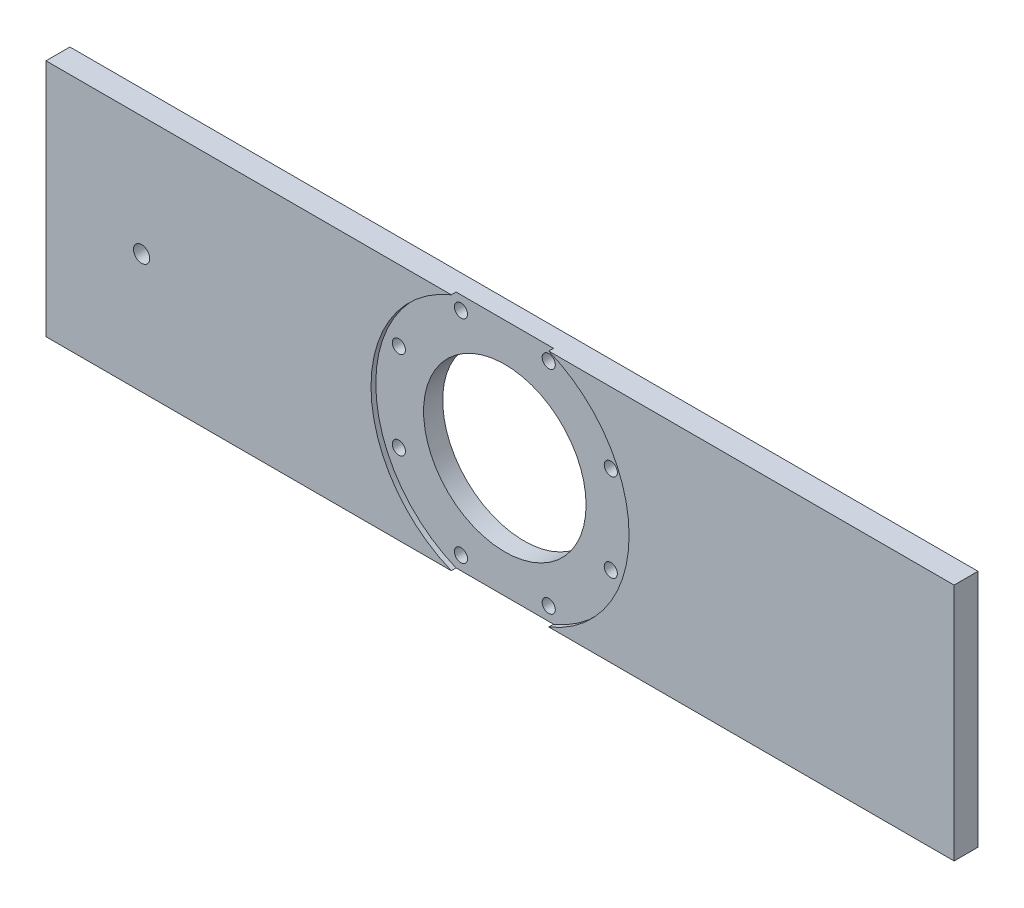
ISO-10303-21;
HEADER;
FILE_DESCRIPTION(('STEP AP214'),'2;1');
FILE_NAME('part.step','',(''),(''),'','','');
FILE_SCHEMA(('AUTOMOTIVE_DESIGN { 1 0 10303 214 1 1 1 1 }'));
ENDSEC;
DATA;
#1=APPLICATION_CONTEXT('core data for automotive mechanical design processes');
#2=APPLICATION_PROTOCOL_DEFINITION('international standard','automotive_design',2000,#1);
#3=PRODUCT_CONTEXT('',#1,'mechanical');
#4=PRODUCT('Part','Part','',(#3));
#5=PRODUCT_RELATED_PRODUCT_CATEGORY('part','',(#4));
#6=PRODUCT_DEFINITION_FORMATION('','',#4);
#7=PRODUCT_DEFINITION_CONTEXT('part definition',#1,'design');
#8=PRODUCT_DEFINITION('design','',#6,#7);
#9=PRODUCT_DEFINITION_SHAPE('','',#8);
#10=(LENGTH_UNIT() NAMED_UNIT(*) SI_UNIT(.MILLI.,.METRE.));
#11=(NAMED_UNIT(*) PLANE_ANGLE_UNIT() SI_UNIT($,.RADIAN.));
#12=(NAMED_UNIT(*) SI_UNIT($,.STERADIAN.) SOLID_ANGLE_UNIT());
#13=UNCERTAINTY_MEASURE_WITH_UNIT(LENGTH_MEASURE(1.E-05),#10,'distance_accuracy_value','');
#14=(GEOMETRIC_REPRESENTATION_CONTEXT(3) GLOBAL_UNCERTAINTY_ASSIGNED_CONTEXT((#13)) GLOBAL_UNIT_ASSIGNED_CONTEXT((#10,
#11,#12)) REPRESENTATION_CONTEXT('',''));
#15=CARTESIAN_POINT('',(0.,0.,0.));
#16=DIRECTION('',(0.,0.,1.));
#17=DIRECTION('',(1.,0.,0.));
#18=AXIS2_PLACEMENT_3D('',#15,#16,#17);
#19=CARTESIAN_POINT('',(0.,0.,10.));
#20=DIRECTION('',(0.,0.,1.));
#21=DIRECTION('',(1.,0.,0.));
#22=AXIS2_PLACEMENT_3D('',#19,#20,#21);
#23=PLANE('',#22);
#24=CARTESIAN_POINT('',(-150.,0.,10.));
#25=DIRECTION('',(0.,0.,1.));
#26=DIRECTION('',(1.,0.,0.));
#27=AXIS2_PLACEMENT_3D('',#24,#25,#26);
#28=CIRCLE('',#27,3.4);
#29=CARTESIAN_POINT('',(-146.6,0.,10.));
#30=VERTEX_POINT('',#29);
#31=EDGE_CURVE('E236',#30,#30,#28,.T.);
#32=ORIENTED_EDGE('',*,*,#31,.F.);
#33=EDGE_LOOP('',(#32));
#34=FACE_BOUND('',#33,.T.);
#35=CARTESIAN_POINT('',(0.,0.,10.));
#36=DIRECTION('',(0.,0.,1.));
#37=DIRECTION('',(1.,0.,0.));
#38=AXIS2_PLACEMENT_3D('',#35,#36,#37);
#39=CIRCLE('',#38,54.);
#40=CARTESIAN_POINT('',(-20.3960780543711,50.,10.));
#41=VERTEX_POINT('',#40);
#42=CARTESIAN_POINT('',(-20.3960780543711,-50.,10.));
#43=VERTEX_POINT('',#42);
#44=EDGE_CURVE('E45',#41,#43,#39,.T.);
#45=ORIENTED_EDGE('',*,*,#44,.F.);
#46=DIRECTION('',(-1.,0.,0.));
#47=VECTOR('',#46,1.);
#48=CARTESIAN_POINT('',(190.,50.,10.));
#49=LINE('',#48,#47);
#50=CARTESIAN_POINT('',(-190.,50.,10.));
#51=VERTEX_POINT('',#50);
#52=EDGE_CURVE('E137',#41,#51,#49,.T.);
#53=ORIENTED_EDGE('',*,*,#52,.T.);
#54=DIRECTION('',(0.,1.,0.));
#55=VECTOR('',#54,1.);
#56=CARTESIAN_POINT('',(-190.,-50.,10.));
#57=LINE('',#56,#55);
#58=CARTESIAN_POINT('',(-190.,-50.,10.));
#59=VERTEX_POINT('',#58);
#60=EDGE_CURVE('E140',#59,#51,#57,.T.);
#61=ORIENTED_EDGE('',*,*,#60,.F.);
#62=DIRECTION('',(-1.,0.,0.));
#63=VECTOR('',#62,1.);
#64=CARTESIAN_POINT('',(190.,-50.,10.));
#65=LINE('',#64,#63);
#66=EDGE_CURVE('E143',#43,#59,#65,.T.);
#67=ORIENTED_EDGE('',*,*,#66,.F.);
#68=EDGE_LOOP('',(#45,#53,#61,#67));
#69=FACE_BOUND('',#68,.T.);
#70=ADVANCED_FACE('F37',(#34,#69),#23,.T.);
#71=CARTESIAN_POINT('',(190.,-50.,10.));
#72=DIRECTION('',(-1.,0.,0.));
#73=DIRECTION('',(0.,0.,1.));
#74=AXIS2_PLACEMENT_3D('',#71,#72,#73);
#75=PLANE('',#74);
#76=DIRECTION('',(0.,1.,0.));
#77=VECTOR('',#76,1.);
#78=CARTESIAN_POINT('',(190.,-50.,0.));
#79=LINE('',#78,#77);
#80=CARTESIAN_POINT('',(190.,-50.,0.));
#81=VERTEX_POINT('',#80);
#82=CARTESIAN_POINT('',(190.,50.,0.));
#83=VERTEX_POINT('',#82);
#84=EDGE_CURVE('E129',#81,#83,#79,.T.);
#85=ORIENTED_EDGE('',*,*,#84,.T.);
#86=DIRECTION('',(0.,0.,-1.));
#87=VECTOR('',#86,1.);
#88=CARTESIAN_POINT('',(190.,50.,10.));
#89=LINE('',#88,#87);
#90=CARTESIAN_POINT('',(190.,50.,10.));
#91=VERTEX_POINT('',#90);
#92=EDGE_CURVE('E158',#91,#83,#89,.T.);
#93=ORIENTED_EDGE('',*,*,#92,.F.);
#94=DIRECTION('',(0.,1.,0.));
#95=VECTOR('',#94,1.);
#96=CARTESIAN_POINT('',(190.,-50.,10.));
#97=LINE('',#96,#95);
#98=CARTESIAN_POINT('',(190.,-50.,10.));
#99=VERTEX_POINT('',#98);
#100=EDGE_CURVE('E135',#99,#91,#97,.T.);
#101=ORIENTED_EDGE('',*,*,#100,.F.);
#102=DIRECTION('',(0.,0.,-1.));
#103=VECTOR('',#102,1.);
#104=CARTESIAN_POINT('',(190.,-50.,10.));
#105=LINE('',#104,#103);
#106=EDGE_CURVE('E61',#99,#81,#105,.T.);
#107=ORIENTED_EDGE('',*,*,#106,.T.);
#108=EDGE_LOOP('',(#85,#93,#101,#107));
#109=FACE_BOUND('',#108,.T.);
#110=ADVANCED_FACE('F39',(#109),#75,.F.);
#111=CARTESIAN_POINT('',(190.,50.,10.));
#112=DIRECTION('',(0.,-1.,0.));
#113=DIRECTION('',(1.,0.,0.));
#114=AXIS2_PLACEMENT_3D('',#111,#112,#113);
#115=PLANE('',#114);
#116=DIRECTION('',(-1.,0.,0.));
#117=VECTOR('',#116,1.);
#118=CARTESIAN_POINT('',(190.,50.,8.));
#119=LINE('',#118,#117);
#120=CARTESIAN_POINT('',(20.3960780543711,50.,8.));
#121=VERTEX_POINT('',#120);
#122=CARTESIAN_POINT('',(-20.3960780543711,50.,8.));
#123=VERTEX_POINT('',#122);
#124=EDGE_CURVE('E116',#121,#123,#119,.T.);
#125=ORIENTED_EDGE('',*,*,#124,.F.);
#126=DIRECTION('',(0.,0.,1.));
#127=VECTOR('',#126,1.);
#128=CARTESIAN_POINT('',(20.3960780543711,50.,8.));
#129=LINE('',#128,#127);
#130=CARTESIAN_POINT('',(20.3960780543711,50.,10.));
#131=VERTEX_POINT('',#130);
#132=EDGE_CURVE('E110',#121,#131,#129,.T.);
#133=ORIENTED_EDGE('',*,*,#132,.T.);
#134=EDGE_CURVE('E88',#91,#131,#49,.T.);
#135=ORIENTED_EDGE('',*,*,#134,.F.);
#136=ORIENTED_EDGE('',*,*,#92,.T.);
#137=DIRECTION('',(-1.,0.,0.));
#138=VECTOR('',#137,1.);
#139=CARTESIAN_POINT('',(190.,50.,0.));
#140=LINE('',#139,#138);
#141=CARTESIAN_POINT('',(-190.,50.,0.));
#142=VERTEX_POINT('',#141);
#143=EDGE_CURVE('E131',#83,#142,#140,.T.);
#144=ORIENTED_EDGE('',*,*,#143,.T.);
#145=DIRECTION('',(0.,0.,-1.));
#146=VECTOR('',#145,1.);
#147=CARTESIAN_POINT('',(-190.,50.,10.));
#148=LINE('',#147,#146);
#149=EDGE_CURVE('E156',#51,#142,#148,.T.);
#150=ORIENTED_EDGE('',*,*,#149,.F.);
#151=ORIENTED_EDGE('',*,*,#52,.F.);
#152=DIRECTION('',(0.,0.,1.));
#153=VECTOR('',#152,1.);
#154=CARTESIAN_POINT('',(-20.3960780543711,50.,8.));
#155=LINE('',#154,#153);
#156=EDGE_CURVE('E117',#41,#123,#155,.F.);
#157=ORIENTED_EDGE('',*,*,#156,.T.);
#158=EDGE_LOOP('',(#125,#133,#135,#136,#144,#150,#151,#157));
#159=FACE_BOUND('',#158,.T.);
#160=ADVANCED_FACE('F127',(#159),#115,.F.);
#161=CARTESIAN_POINT('',(-190.,-50.,10.));
#162=DIRECTION('',(-1.,0.,0.));
#163=DIRECTION('',(0.,0.,1.));
#164=AXIS2_PLACEMENT_3D('',#161,#162,#163);
#165=PLANE('',#164);
#166=DIRECTION('',(0.,1.,0.));
#167=VECTOR('',#166,1.);
#168=CARTESIAN_POINT('',(-190.,-50.,0.));
#169=LINE('',#168,#167);
#170=CARTESIAN_POINT('',(-190.,-50.,0.));
#171=VERTEX_POINT('',#170);
#172=EDGE_CURVE('E148',#171,#142,#169,.T.);
#173=ORIENTED_EDGE('',*,*,#172,.F.);
#174=DIRECTION('',(0.,0.,-1.));
#175=VECTOR('',#174,1.);
#176=CARTESIAN_POINT('',(-190.,-50.,10.));
#177=LINE('',#176,#175);
#178=EDGE_CURVE('E154',#59,#171,#177,.T.);
#179=ORIENTED_EDGE('',*,*,#178,.F.);
#180=ORIENTED_EDGE('',*,*,#60,.T.);
#181=ORIENTED_EDGE('',*,*,#149,.T.);
#182=EDGE_LOOP('',(#173,#179,#180,#181));
#183=FACE_BOUND('',#182,.T.);
#184=ADVANCED_FACE('F173',(#183),#165,.T.);
#185=CARTESIAN_POINT('',(190.,-50.,10.));
#186=DIRECTION('',(0.,-1.,0.));
#187=DIRECTION('',(1.,0.,0.));
#188=AXIS2_PLACEMENT_3D('',#185,#186,#187);
#189=PLANE('',#188);
#190=DIRECTION('',(0.,0.,1.));
#191=VECTOR('',#190,1.);
#192=CARTESIAN_POINT('',(20.3960780543711,-50.,8.));
#193=LINE('',#192,#191);
#194=CARTESIAN_POINT('',(20.3960780543711,-50.,8.));
#195=VERTEX_POINT('',#194);
#196=CARTESIAN_POINT('',(20.3960780543711,-50.,10.));
#197=VERTEX_POINT('',#196);
#198=EDGE_CURVE('E52',#195,#197,#193,.T.);
#199=ORIENTED_EDGE('',*,*,#198,.F.);
#200=DIRECTION('',(-1.,0.,0.));
#201=VECTOR('',#200,1.);
#202=CARTESIAN_POINT('',(190.,-50.,8.));
#203=LINE('',#202,#201);
#204=CARTESIAN_POINT('',(-20.3960780543711,-50.,8.));
#205=VERTEX_POINT('',#204);
#206=EDGE_CURVE('E11',#195,#205,#203,.T.);
#207=ORIENTED_EDGE('',*,*,#206,.T.);
#208=DIRECTION('',(0.,0.,1.));
#209=VECTOR('',#208,1.);
#210=CARTESIAN_POINT('',(-20.3960780543711,-50.,8.));
#211=LINE('',#210,#209);
#212=EDGE_CURVE('E163',#43,#205,#211,.F.);
#213=ORIENTED_EDGE('',*,*,#212,.F.);
#214=ORIENTED_EDGE('',*,*,#66,.T.);
#215=ORIENTED_EDGE('',*,*,#178,.T.);
#216=DIRECTION('',(-1.,0.,0.));
#217=VECTOR('',#216,1.);
#218=CARTESIAN_POINT('',(190.,-50.,0.));
#219=LINE('',#218,#217);
#220=EDGE_CURVE('E138',#81,#171,#219,.T.);
#221=ORIENTED_EDGE('',*,*,#220,.F.);
#222=ORIENTED_EDGE('',*,*,#106,.F.);
#223=EDGE_CURVE('E144',#99,#197,#65,.T.);
#224=ORIENTED_EDGE('',*,*,#223,.T.);
#225=EDGE_LOOP('',(#199,#207,#213,#214,#215,#221,#222,#224));
#226=FACE_BOUND('',#225,.T.);
#227=ADVANCED_FACE('F166',(#226),#189,.T.);
#228=EDGE_CURVE('E114',#197,#131,#39,.T.);
#229=ORIENTED_EDGE('',*,*,#228,.F.);
#230=ORIENTED_EDGE('',*,*,#223,.F.);
#231=ORIENTED_EDGE('',*,*,#100,.T.);
#232=ORIENTED_EDGE('',*,*,#134,.T.);
#233=EDGE_LOOP('',(#229,#230,#231,#232));
#234=FACE_BOUND('',#233,.T.);
#235=ADVANCED_FACE('F179',(#234),#23,.T.);
#236=CARTESIAN_POINT('',(0.,0.,0.));
#237=DIRECTION('',(0.,0.,1.));
#238=DIRECTION('',(1.,0.,0.));
#239=AXIS2_PLACEMENT_3D('',#236,#237,#238);
#240=PLANE('',#239);
#241=CARTESIAN_POINT('',(-150.,0.,0.));
#242=DIRECTION('',(0.,0.,1.));
#243=DIRECTION('',(1.,0.,0.));
#244=AXIS2_PLACEMENT_3D('',#241,#242,#243);
#245=CIRCLE('',#244,3.4);
#246=CARTESIAN_POINT('',(-146.6,0.,0.));
#247=VERTEX_POINT('',#246);
#248=EDGE_CURVE('E233',#247,#247,#245,.T.);
#249=ORIENTED_EDGE('',*,*,#248,.T.);
#250=EDGE_LOOP('',(#249));
#251=FACE_BOUND('',#250,.T.);
#252=CARTESIAN_POINT('',(0.,0.,0.));
#253=DIRECTION('',(0.,0.,1.));
#254=DIRECTION('',(1.,0.,0.));
#255=AXIS2_PLACEMENT_3D('',#252,#253,#254);
#256=CIRCLE('',#255,34.);
#257=CARTESIAN_POINT('',(34.,0.,0.));
#258=VERTEX_POINT('',#257);
#259=EDGE_CURVE('E198',#258,#258,#256,.T.);
#260=ORIENTED_EDGE('',*,*,#259,.T.);
#261=EDGE_LOOP('',(#260));
#262=FACE_BOUND('',#261,.T.);
#263=CARTESIAN_POINT('',(-44.346217560542,18.3688047535237,0.));
#264=DIRECTION('',(0.,0.,1.));
#265=DIRECTION('',(0.707106781186556,-0.707106781186539,0.));
#266=AXIS2_PLACEMENT_3D('',#263,#264,#265);
#267=CIRCLE('',#266,2.75);
#268=CARTESIAN_POINT('',(-42.401673912279,16.4242611052608,0.));
#269=VERTEX_POINT('',#268);
#270=EDGE_CURVE('E197',#269,#269,#267,.T.);
#271=ORIENTED_EDGE('',*,*,#270,.T.);
#272=EDGE_LOOP('',(#271));
#273=FACE_BOUND('',#272,.T.);
#274=CARTESIAN_POINT('',(-18.3688047535248,44.3462175605416,0.));
#275=DIRECTION('',(0.,0.,1.));
#276=DIRECTION('',(0.,-1.,0.));
#277=AXIS2_PLACEMENT_3D('',#274,#275,#276);
#278=CIRCLE('',#277,2.75);
#279=CARTESIAN_POINT('',(-18.3688047535248,41.5962175605416,0.));
#280=VERTEX_POINT('',#279);
#281=EDGE_CURVE('E204',#280,#280,#278,.T.);
#282=ORIENTED_EDGE('',*,*,#281,.T.);
#283=EDGE_LOOP('',(#282));
#284=FACE_BOUND('',#283,.T.);
#285=CARTESIAN_POINT('',(18.3688047535239,44.3462175605419,0.));
#286=DIRECTION('',(0.,0.,1.));
#287=DIRECTION('',(-0.707106781186541,-0.707106781186554,0.));
#288=AXIS2_PLACEMENT_3D('',#285,#286,#287);
#289=CIRCLE('',#288,2.75);
#290=CARTESIAN_POINT('',(16.4242611052609,42.4016739122789,0.));
#291=VERTEX_POINT('',#290);
#292=EDGE_CURVE('E210',#291,#291,#289,.T.);
#293=ORIENTED_EDGE('',*,*,#292,.T.);
#294=EDGE_LOOP('',(#293));
#295=FACE_BOUND('',#294,.T.);
#296=CARTESIAN_POINT('',(44.3462175605418,18.3688047535243,0.));
#297=DIRECTION('',(0.,0.,1.));
#298=DIRECTION('',(-1.,0.,0.));
#299=AXIS2_PLACEMENT_3D('',#296,#297,#298);
#300=CIRCLE('',#299,2.75);
#301=CARTESIAN_POINT('',(41.5962175605418,18.3688047535243,0.));
#302=VERTEX_POINT('',#301);
#303=EDGE_CURVE('E216',#302,#302,#300,.T.);
#304=ORIENTED_EDGE('',*,*,#303,.T.);
#305=EDGE_LOOP('',(#304));
#306=FACE_BOUND('',#305,.T.);
#307=CARTESIAN_POINT('',(44.3462175605419,-18.368804753524,0.));
#308=DIRECTION('',(0.,0.,1.));
#309=DIRECTION('',(-0.707106781186551,0.707106781186544,0.));
#310=AXIS2_PLACEMENT_3D('',#307,#308,#309);
#311=CIRCLE('',#310,2.75);
#312=CARTESIAN_POINT('',(42.4016739122789,-16.424261105261,0.));
#313=VERTEX_POINT('',#312);
#314=EDGE_CURVE('E222',#313,#313,#311,.T.);
#315=ORIENTED_EDGE('',*,*,#314,.T.);
#316=EDGE_LOOP('',(#315));
#317=FACE_BOUND('',#316,.T.);
#318=CARTESIAN_POINT('',(18.3688047535245,-44.3462175605417,0.));
#319=DIRECTION('',(0.,0.,1.));
#320=DIRECTION('',(0.,1.,0.));
#321=AXIS2_PLACEMENT_3D('',#318,#319,#320);
#322=CIRCLE('',#321,2.75);
#323=CARTESIAN_POINT('',(18.3688047535245,-41.5962175605417,0.));
#324=VERTEX_POINT('',#323);
#325=EDGE_CURVE('E191',#324,#324,#322,.T.);
#326=ORIENTED_EDGE('',*,*,#325,.T.);
#327=EDGE_LOOP('',(#326));
#328=FACE_BOUND('',#327,.T.);
#329=CARTESIAN_POINT('',(-18.3688047535242,-44.3462175605418,0.));
#330=DIRECTION('',(0.,0.,1.));
#331=DIRECTION('',(0.707106781186546,0.707106781186549,0.));
#332=AXIS2_PLACEMENT_3D('',#329,#330,#331);
#333=CIRCLE('',#332,2.75);
#334=CARTESIAN_POINT('',(-16.4242611052612,-42.4016739122788,0.));
#335=VERTEX_POINT('',#334);
#336=EDGE_CURVE('E185',#335,#335,#333,.T.);
#337=ORIENTED_EDGE('',*,*,#336,.T.);
#338=EDGE_LOOP('',(#337));
#339=FACE_BOUND('',#338,.T.);
#340=CARTESIAN_POINT('',(-44.3462175605418,-18.3688047535243,0.));
#341=DIRECTION('',(0.,0.,1.));
#342=DIRECTION('',(1.,0.,0.));
#343=AXIS2_PLACEMENT_3D('',#340,#341,#342);
#344=CIRCLE('',#343,2.75);
#345=CARTESIAN_POINT('',(-41.5962175605418,-18.3688047535243,0.));
#346=VERTEX_POINT('',#345);
#347=EDGE_CURVE('E124',#346,#346,#344,.T.);
#348=ORIENTED_EDGE('',*,*,#347,.T.);
#349=EDGE_LOOP('',(#348));
#350=FACE_BOUND('',#349,.T.);
#351=ORIENTED_EDGE('',*,*,#84,.F.);
#352=ORIENTED_EDGE('',*,*,#220,.T.);
#353=ORIENTED_EDGE('',*,*,#172,.T.);
#354=ORIENTED_EDGE('',*,*,#143,.F.);
#355=EDGE_LOOP('',(#351,#352,#353,#354));
#356=FACE_BOUND('',#355,.T.);
#357=ADVANCED_FACE('F175',(#251,#262,#273,#284,#295,#306,#317,#328,#339,#350,#356),#240,.F.);
#358=CARTESIAN_POINT('',(0.,0.,8.));
#359=DIRECTION('',(0.,0.,1.));
#360=DIRECTION('',(1.,0.,0.));
#361=AXIS2_PLACEMENT_3D('',#358,#359,#360);
#362=PLANE('',#361);
#363=CARTESIAN_POINT('',(0.,0.,8.));
#364=DIRECTION('',(0.,0.,1.));
#365=DIRECTION('',(1.,0.,0.));
#366=AXIS2_PLACEMENT_3D('',#363,#364,#365);
#367=CIRCLE('',#366,34.);
#368=CARTESIAN_POINT('',(34.,0.,8.));
#369=VERTEX_POINT('',#368);
#370=EDGE_CURVE('E230',#369,#369,#367,.T.);
#371=ORIENTED_EDGE('',*,*,#370,.F.);
#372=EDGE_LOOP('',(#371));
#373=FACE_BOUND('',#372,.T.);
#374=CARTESIAN_POINT('',(-44.346217560542,18.3688047535237,8.));
#375=DIRECTION('',(0.,0.,1.));
#376=DIRECTION('',(0.707106781186556,-0.707106781186539,0.));
#377=AXIS2_PLACEMENT_3D('',#374,#375,#376);
#378=CIRCLE('',#377,2.75);
#379=CARTESIAN_POINT('',(-42.401673912279,16.4242611052608,8.));
#380=VERTEX_POINT('',#379);
#381=EDGE_CURVE('E194',#380,#380,#378,.T.);
#382=ORIENTED_EDGE('',*,*,#381,.F.);
#383=EDGE_LOOP('',(#382));
#384=FACE_BOUND('',#383,.T.);
#385=CARTESIAN_POINT('',(-18.3688047535248,44.3462175605416,8.));
#386=DIRECTION('',(0.,0.,1.));
#387=DIRECTION('',(0.,-1.,0.));
#388=AXIS2_PLACEMENT_3D('',#385,#386,#387);
#389=CIRCLE('',#388,2.75);
#390=CARTESIAN_POINT('',(-18.3688047535248,41.5962175605416,8.));
#391=VERTEX_POINT('',#390);
#392=EDGE_CURVE('E201',#391,#391,#389,.T.);
#393=ORIENTED_EDGE('',*,*,#392,.F.);
#394=EDGE_LOOP('',(#393));
#395=FACE_BOUND('',#394,.T.);
#396=CARTESIAN_POINT('',(18.3688047535239,44.3462175605419,8.));
#397=DIRECTION('',(0.,0.,1.));
#398=DIRECTION('',(-0.707106781186541,-0.707106781186554,0.));
#399=AXIS2_PLACEMENT_3D('',#396,#397,#398);
#400=CIRCLE('',#399,2.75);
#401=CARTESIAN_POINT('',(16.4242611052609,42.4016739122789,8.));
#402=VERTEX_POINT('',#401);
#403=EDGE_CURVE('E207',#402,#402,#400,.T.);
#404=ORIENTED_EDGE('',*,*,#403,.F.);
#405=EDGE_LOOP('',(#404));
#406=FACE_BOUND('',#405,.T.);
#407=CARTESIAN_POINT('',(44.3462175605418,18.3688047535243,8.));
#408=DIRECTION('',(0.,0.,1.));
#409=DIRECTION('',(-1.,0.,0.));
#410=AXIS2_PLACEMENT_3D('',#407,#408,#409);
#411=CIRCLE('',#410,2.75);
#412=CARTESIAN_POINT('',(41.5962175605418,18.3688047535243,8.));
#413=VERTEX_POINT('',#412);
#414=EDGE_CURVE('E213',#413,#413,#411,.T.);
#415=ORIENTED_EDGE('',*,*,#414,.F.);
#416=EDGE_LOOP('',(#415));
#417=FACE_BOUND('',#416,.T.);
#418=CARTESIAN_POINT('',(44.3462175605419,-18.368804753524,8.));
#419=DIRECTION('',(0.,0.,1.));
#420=DIRECTION('',(-0.707106781186551,0.707106781186544,0.));
#421=AXIS2_PLACEMENT_3D('',#418,#419,#420);
#422=CIRCLE('',#421,2.75);
#423=CARTESIAN_POINT('',(42.4016739122789,-16.424261105261,8.));
#424=VERTEX_POINT('',#423);
#425=EDGE_CURVE('E219',#424,#424,#422,.T.);
#426=ORIENTED_EDGE('',*,*,#425,.F.);
#427=EDGE_LOOP('',(#426));
#428=FACE_BOUND('',#427,.T.);
#429=CARTESIAN_POINT('',(18.3688047535245,-44.3462175605417,8.));
#430=DIRECTION('',(0.,0.,1.));
#431=DIRECTION('',(0.,1.,0.));
#432=AXIS2_PLACEMENT_3D('',#429,#430,#431);
#433=CIRCLE('',#432,2.75);
#434=CARTESIAN_POINT('',(18.3688047535245,-41.5962175605417,8.));
#435=VERTEX_POINT('',#434);
#436=EDGE_CURVE('E225',#435,#435,#433,.T.);
#437=ORIENTED_EDGE('',*,*,#436,.F.);
#438=EDGE_LOOP('',(#437));
#439=FACE_BOUND('',#438,.T.);
#440=CARTESIAN_POINT('',(-18.3688047535242,-44.3462175605418,8.));
#441=DIRECTION('',(0.,0.,1.));
#442=DIRECTION('',(0.707106781186546,0.707106781186549,0.));
#443=AXIS2_PLACEMENT_3D('',#440,#441,#442);
#444=CIRCLE('',#443,2.75);
#445=CARTESIAN_POINT('',(-16.4242611052612,-42.4016739122788,8.));
#446=VERTEX_POINT('',#445);
#447=EDGE_CURVE('E188',#446,#446,#444,.T.);
#448=ORIENTED_EDGE('',*,*,#447,.F.);
#449=EDGE_LOOP('',(#448));
#450=FACE_BOUND('',#449,.T.);
#451=CARTESIAN_POINT('',(-44.3462175605418,-18.3688047535243,8.));
#452=DIRECTION('',(0.,0.,1.));
#453=DIRECTION('',(1.,0.,0.));
#454=AXIS2_PLACEMENT_3D('',#451,#452,#453);
#455=CIRCLE('',#454,2.75);
#456=CARTESIAN_POINT('',(-41.5962175605418,-18.3688047535243,8.));
#457=VERTEX_POINT('',#456);
#458=EDGE_CURVE('E182',#457,#457,#455,.T.);
#459=ORIENTED_EDGE('',*,*,#458,.F.);
#460=EDGE_LOOP('',(#459));
#461=FACE_BOUND('',#460,.T.);
#462=ORIENTED_EDGE('',*,*,#124,.T.);
#463=CARTESIAN_POINT('',(0.,0.,8.));
#464=DIRECTION('',(0.,0.,1.));
#465=DIRECTION('',(1.,0.,0.));
#466=AXIS2_PLACEMENT_3D('',#463,#464,#465);
#467=CIRCLE('',#466,54.);
#468=EDGE_CURVE('E123',#123,#205,#467,.T.);
#469=ORIENTED_EDGE('',*,*,#468,.T.);
#470=ORIENTED_EDGE('',*,*,#206,.F.);
#471=EDGE_CURVE('E113',#195,#121,#467,.T.);
#472=ORIENTED_EDGE('',*,*,#471,.T.);
#473=EDGE_LOOP('',(#462,#469,#470,#472));
#474=FACE_BOUND('',#473,.T.);
#475=ADVANCED_FACE('F120',(#373,#384,#395,#406,#417,#428,#439,#450,#461,#474),#362,.T.);
#476=CARTESIAN_POINT('',(0.,0.,8.));
#477=DIRECTION('',(0.,0.,1.));
#478=DIRECTION('',(1.,0.,0.));
#479=AXIS2_PLACEMENT_3D('',#476,#477,#478);
#480=CYLINDRICAL_SURFACE('',#479,54.);
#481=ORIENTED_EDGE('',*,*,#471,.F.);
#482=ORIENTED_EDGE('',*,*,#198,.T.);
#483=ORIENTED_EDGE('',*,*,#228,.T.);
#484=ORIENTED_EDGE('',*,*,#132,.F.);
#485=EDGE_LOOP('',(#481,#482,#483,#484));
#486=FACE_BOUND('',#485,.T.);
#487=ADVANCED_FACE('F112',(#486),#480,.F.);
#488=ORIENTED_EDGE('',*,*,#44,.T.);
#489=ORIENTED_EDGE('',*,*,#212,.T.);
#490=ORIENTED_EDGE('',*,*,#468,.F.);
#491=ORIENTED_EDGE('',*,*,#156,.F.);
#492=EDGE_LOOP('',(#488,#489,#490,#491));
#493=FACE_BOUND('',#492,.T.);
#494=ADVANCED_FACE('F162',(#493),#480,.F.);
#495=CARTESIAN_POINT('',(-44.3462175605418,-18.3688047535243,0.));
#496=DIRECTION('',(0.,0.,1.));
#497=DIRECTION('',(1.,0.,0.));
#498=AXIS2_PLACEMENT_3D('',#495,#496,#497);
#499=CYLINDRICAL_SURFACE('',#498,2.75);
#500=ORIENTED_EDGE('',*,*,#347,.F.);
#501=EDGE_LOOP('',(#500));
#502=FACE_BOUND('',#501,.T.);
#503=ORIENTED_EDGE('',*,*,#458,.T.);
#504=EDGE_LOOP('',(#503));
#505=FACE_BOUND('',#504,.T.);
#506=ADVANCED_FACE('F327',(#502,#505),#499,.F.);
#507=CARTESIAN_POINT('',(-18.3688047535242,-44.3462175605418,0.));
#508=DIRECTION('',(0.,0.,1.));
#509=DIRECTION('',(1.,0.,0.));
#510=AXIS2_PLACEMENT_3D('',#507,#508,#509);
#511=CYLINDRICAL_SURFACE('',#510,2.75);
#512=ORIENTED_EDGE('',*,*,#336,.F.);
#513=EDGE_LOOP('',(#512));
#514=FACE_BOUND('',#513,.T.);
#515=ORIENTED_EDGE('',*,*,#447,.T.);
#516=EDGE_LOOP('',(#515));
#517=FACE_BOUND('',#516,.T.);
#518=ADVANCED_FACE('F334',(#514,#517),#511,.F.);
#519=CARTESIAN_POINT('',(18.3688047535245,-44.3462175605417,0.));
#520=DIRECTION('',(0.,0.,1.));
#521=DIRECTION('',(1.,0.,0.));
#522=AXIS2_PLACEMENT_3D('',#519,#520,#521);
#523=CYLINDRICAL_SURFACE('',#522,2.75);
#524=ORIENTED_EDGE('',*,*,#325,.F.);
#525=EDGE_LOOP('',(#524));
#526=FACE_BOUND('',#525,.T.);
#527=ORIENTED_EDGE('',*,*,#436,.T.);
#528=EDGE_LOOP('',(#527));
#529=FACE_BOUND('',#528,.T.);
#530=ADVANCED_FACE('F343',(#526,#529),#523,.F.);
#531=CARTESIAN_POINT('',(44.3462175605419,-18.368804753524,0.));
#532=DIRECTION('',(0.,0.,1.));
#533=DIRECTION('',(1.,0.,0.));
#534=AXIS2_PLACEMENT_3D('',#531,#532,#533);
#535=CYLINDRICAL_SURFACE('',#534,2.75);
#536=ORIENTED_EDGE('',*,*,#314,.F.);
#537=EDGE_LOOP('',(#536));
#538=FACE_BOUND('',#537,.T.);
#539=ORIENTED_EDGE('',*,*,#425,.T.);
#540=EDGE_LOOP('',(#539));
#541=FACE_BOUND('',#540,.T.);
#542=ADVANCED_FACE('F352',(#538,#541),#535,.F.);
#543=CARTESIAN_POINT('',(44.3462175605418,18.3688047535243,0.));
#544=DIRECTION('',(0.,0.,1.));
#545=DIRECTION('',(1.,0.,0.));
#546=AXIS2_PLACEMENT_3D('',#543,#544,#545);
#547=CYLINDRICAL_SURFACE('',#546,2.75);
#548=ORIENTED_EDGE('',*,*,#303,.F.);
#549=EDGE_LOOP('',(#548));
#550=FACE_BOUND('',#549,.T.);
#551=ORIENTED_EDGE('',*,*,#414,.T.);
#552=EDGE_LOOP('',(#551));
#553=FACE_BOUND('',#552,.T.);
#554=ADVANCED_FACE('F361',(#550,#553),#547,.F.);
#555=CARTESIAN_POINT('',(18.3688047535239,44.3462175605419,0.));
#556=DIRECTION('',(0.,0.,1.));
#557=DIRECTION('',(1.,0.,0.));
#558=AXIS2_PLACEMENT_3D('',#555,#556,#557);
#559=CYLINDRICAL_SURFACE('',#558,2.75);
#560=ORIENTED_EDGE('',*,*,#292,.F.);
#561=EDGE_LOOP('',(#560));
#562=FACE_BOUND('',#561,.T.);
#563=ORIENTED_EDGE('',*,*,#403,.T.);
#564=EDGE_LOOP('',(#563));
#565=FACE_BOUND('',#564,.T.);
#566=ADVANCED_FACE('F370',(#562,#565),#559,.F.);
#567=CARTESIAN_POINT('',(-18.3688047535248,44.3462175605416,0.));
#568=DIRECTION('',(0.,0.,1.));
#569=DIRECTION('',(1.,0.,0.));
#570=AXIS2_PLACEMENT_3D('',#567,#568,#569);
#571=CYLINDRICAL_SURFACE('',#570,2.75);
#572=ORIENTED_EDGE('',*,*,#281,.F.);
#573=EDGE_LOOP('',(#572));
#574=FACE_BOUND('',#573,.T.);
#575=ORIENTED_EDGE('',*,*,#392,.T.);
#576=EDGE_LOOP('',(#575));
#577=FACE_BOUND('',#576,.T.);
#578=ADVANCED_FACE('F379',(#574,#577),#571,.F.);
#579=CARTESIAN_POINT('',(-44.346217560542,18.3688047535237,0.));
#580=DIRECTION('',(0.,0.,1.));
#581=DIRECTION('',(1.,0.,0.));
#582=AXIS2_PLACEMENT_3D('',#579,#580,#581);
#583=CYLINDRICAL_SURFACE('',#582,2.75);
#584=ORIENTED_EDGE('',*,*,#270,.F.);
#585=EDGE_LOOP('',(#584));
#586=FACE_BOUND('',#585,.T.);
#587=ORIENTED_EDGE('',*,*,#381,.T.);
#588=EDGE_LOOP('',(#587));
#589=FACE_BOUND('',#588,.T.);
#590=ADVANCED_FACE('F388',(#586,#589),#583,.F.);
#591=CARTESIAN_POINT('',(0.,0.,0.));
#592=DIRECTION('',(0.,0.,1.));
#593=DIRECTION('',(1.,0.,0.));
#594=AXIS2_PLACEMENT_3D('',#591,#592,#593);
#595=CYLINDRICAL_SURFACE('',#594,34.);
#596=ORIENTED_EDGE('',*,*,#259,.F.);
#597=EDGE_LOOP('',(#596));
#598=FACE_BOUND('',#597,.T.);
#599=ORIENTED_EDGE('',*,*,#370,.T.);
#600=EDGE_LOOP('',(#599));
#601=FACE_BOUND('',#600,.T.);
#602=ADVANCED_FACE('F247',(#598,#601),#595,.F.);
#603=CARTESIAN_POINT('',(-150.,0.,0.));
#604=DIRECTION('',(0.,0.,1.));
#605=DIRECTION('',(1.,0.,0.));
#606=AXIS2_PLACEMENT_3D('',#603,#604,#605);
#607=CYLINDRICAL_SURFACE('',#606,3.4);
#608=ORIENTED_EDGE('',*,*,#248,.F.);
#609=EDGE_LOOP('',(#608));
#610=FACE_BOUND('',#609,.T.);
#611=ORIENTED_EDGE('',*,*,#31,.T.);
#612=EDGE_LOOP('',(#611));
#613=FACE_BOUND('',#612,.T.);
#614=ADVANCED_FACE('F244',(#610,#613),#607,.F.);
#615=CLOSED_SHELL('',(#70,#110,#160,#184,#227,#235,#357,#475,#487,#494,#506,#518,#530,#542,#554,
#566,#578,#590,#602,#614));
#616=MANIFOLD_SOLID_BREP('B2',#615);
#617=ADVANCED_BREP_SHAPE_REPRESENTATION('',(#18,#616),#14);
#618=SHAPE_DEFINITION_REPRESENTATION(#9,#617);
ENDSEC;
END-ISO-10303-21;
